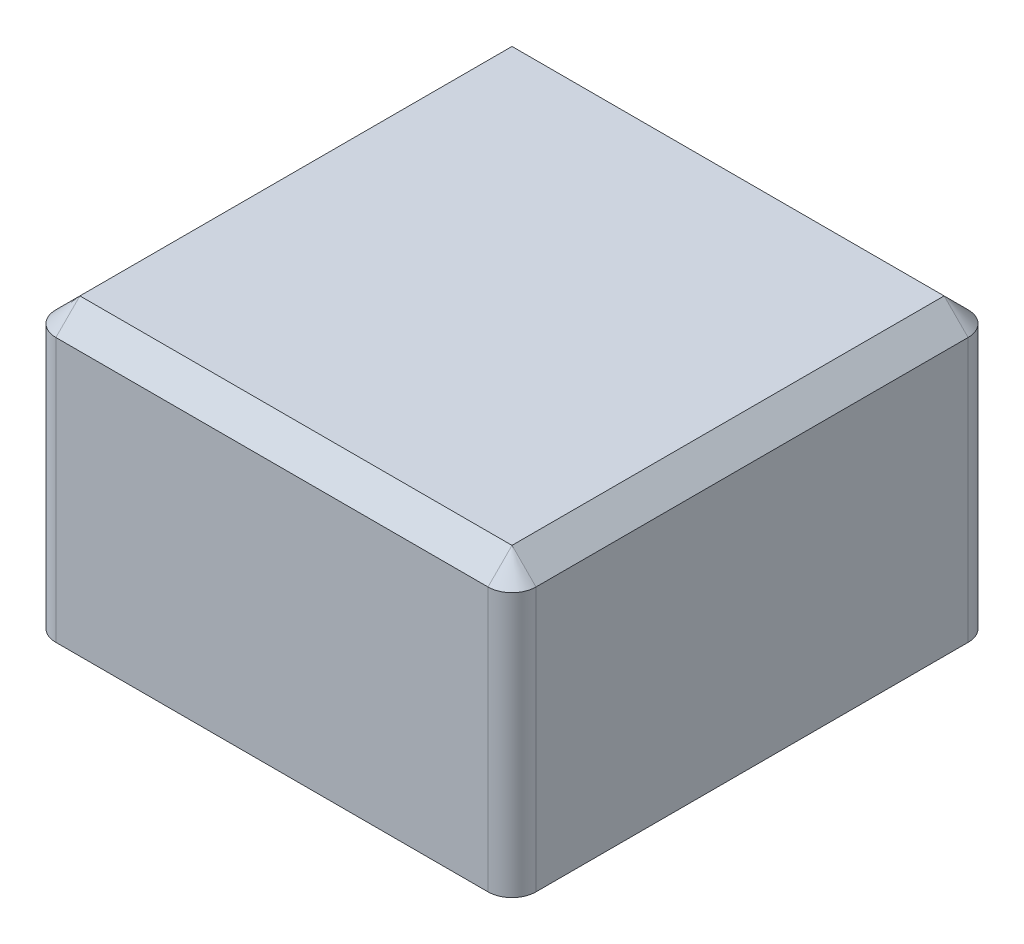
ISO-10303-21;
HEADER;
FILE_DESCRIPTION(('STEP AP214'),'2;1');
FILE_NAME('part.step','',(''),(''),'','','');
FILE_SCHEMA(('AUTOMOTIVE_DESIGN { 1 0 10303 214 1 1 1 1 }'));
ENDSEC;
DATA;
#1=APPLICATION_CONTEXT('core data for automotive mechanical design processes');
#2=APPLICATION_PROTOCOL_DEFINITION('international standard','automotive_design',2000,#1);
#3=PRODUCT_CONTEXT('',#1,'mechanical');
#4=PRODUCT('Part','Part','',(#3));
#5=PRODUCT_RELATED_PRODUCT_CATEGORY('part','',(#4));
#6=PRODUCT_DEFINITION_FORMATION('','',#4);
#7=PRODUCT_DEFINITION_CONTEXT('part definition',#1,'design');
#8=PRODUCT_DEFINITION('design','',#6,#7);
#9=PRODUCT_DEFINITION_SHAPE('','',#8);
#10=(LENGTH_UNIT() NAMED_UNIT(*) SI_UNIT(.MILLI.,.METRE.));
#11=(NAMED_UNIT(*) PLANE_ANGLE_UNIT() SI_UNIT($,.RADIAN.));
#12=(NAMED_UNIT(*) SI_UNIT($,.STERADIAN.) SOLID_ANGLE_UNIT());
#13=UNCERTAINTY_MEASURE_WITH_UNIT(LENGTH_MEASURE(1.E-05),#10,'distance_accuracy_value','');
#14=(GEOMETRIC_REPRESENTATION_CONTEXT(3) GLOBAL_UNCERTAINTY_ASSIGNED_CONTEXT((#13)) GLOBAL_UNIT_ASSIGNED_CONTEXT((#10,
#11,#12)) REPRESENTATION_CONTEXT('',''));
#15=CARTESIAN_POINT('',(0.,0.,0.));
#16=DIRECTION('',(0.,0.,1.));
#17=DIRECTION('',(1.,0.,0.));
#18=AXIS2_PLACEMENT_3D('',#15,#16,#17);
#19=CARTESIAN_POINT('',(0.,0.,100.));
#20=DIRECTION('',(0.,0.,1.));
#21=DIRECTION('',(1.,0.,0.));
#22=AXIS2_PLACEMENT_3D('',#19,#20,#21);
#23=PLANE('',#22);
#24=DIRECTION('',(0.,1.,0.));
#25=VECTOR('',#24,1.);
#26=CARTESIAN_POINT('',(95.,0.,100.));
#27=LINE('',#26,#25);
#28=CARTESIAN_POINT('',(95.,0.,100.));
#29=VERTEX_POINT('',#28);
#30=CARTESIAN_POINT('',(95.,55.,100.));
#31=VERTEX_POINT('',#30);
#32=EDGE_CURVE('E173',#29,#31,#27,.T.);
#33=ORIENTED_EDGE('',*,*,#32,.T.);
#34=DIRECTION('',(-1.,0.,0.));
#35=VECTOR('',#34,1.);
#36=CARTESIAN_POINT('',(0.,55.,100.));
#37=LINE('',#36,#35);
#38=CARTESIAN_POINT('',(5.,55.,100.));
#39=VERTEX_POINT('',#38);
#40=EDGE_CURVE('E168',#31,#39,#37,.T.);
#41=ORIENTED_EDGE('',*,*,#40,.T.);
#42=DIRECTION('',(0.,-1.,0.));
#43=VECTOR('',#42,1.);
#44=CARTESIAN_POINT('',(5.,0.,100.));
#45=LINE('',#44,#43);
#46=CARTESIAN_POINT('',(5.,0.,100.));
#47=VERTEX_POINT('',#46);
#48=EDGE_CURVE('E161',#39,#47,#45,.T.);
#49=ORIENTED_EDGE('',*,*,#48,.T.);
#50=DIRECTION('',(1.,0.,0.));
#51=VECTOR('',#50,1.);
#52=CARTESIAN_POINT('',(0.,0.,100.));
#53=LINE('',#52,#51);
#54=EDGE_CURVE('E165',#47,#29,#53,.T.);
#55=ORIENTED_EDGE('',*,*,#54,.T.);
#56=EDGE_LOOP('',(#33,#41,#49,#55));
#57=FACE_BOUND('',#56,.T.);
#58=ADVANCED_FACE('F80',(#57),#23,.T.);
#59=CARTESIAN_POINT('',(0.,0.,0.));
#60=DIRECTION('',(0.,0.,1.));
#61=DIRECTION('',(1.,0.,0.));
#62=AXIS2_PLACEMENT_3D('',#59,#60,#61);
#63=PLANE('',#62);
#64=DIRECTION('',(0.,-1.,0.));
#65=VECTOR('',#64,1.);
#66=CARTESIAN_POINT('',(5.,60.,0.));
#67=LINE('',#66,#65);
#68=CARTESIAN_POINT('',(5.,0.,0.));
#69=VERTEX_POINT('',#68);
#70=CARTESIAN_POINT('',(5.,55.,0.));
#71=VERTEX_POINT('',#70);
#72=EDGE_CURVE('E226',#69,#71,#67,.F.);
#73=ORIENTED_EDGE('',*,*,#72,.T.);
#74=DIRECTION('',(1.,0.,0.));
#75=VECTOR('',#74,1.);
#76=CARTESIAN_POINT('',(95.,55.,0.));
#77=LINE('',#76,#75);
#78=CARTESIAN_POINT('',(95.,55.,0.));
#79=VERTEX_POINT('',#78);
#80=EDGE_CURVE('E106',#71,#79,#77,.T.);
#81=ORIENTED_EDGE('',*,*,#80,.T.);
#82=DIRECTION('',(0.,1.,0.));
#83=VECTOR('',#82,1.);
#84=CARTESIAN_POINT('',(95.,0.,0.));
#85=LINE('',#84,#83);
#86=CARTESIAN_POINT('',(95.,0.,0.));
#87=VERTEX_POINT('',#86);
#88=EDGE_CURVE('E223',#79,#87,#85,.F.);
#89=ORIENTED_EDGE('',*,*,#88,.T.);
#90=DIRECTION('',(1.,0.,0.));
#91=VECTOR('',#90,1.);
#92=CARTESIAN_POINT('',(0.,0.,0.));
#93=LINE('',#92,#91);
#94=EDGE_CURVE('E196',#69,#87,#93,.T.);
#95=ORIENTED_EDGE('',*,*,#94,.F.);
#96=EDGE_LOOP('',(#73,#81,#89,#95));
#97=FACE_BOUND('',#96,.T.);
#98=ADVANCED_FACE('F310',(#97),#63,.F.);
#99=CARTESIAN_POINT('',(100.,60.,0.));
#100=DIRECTION('',(0.,1.,0.));
#101=DIRECTION('',(0.,0.,1.));
#102=AXIS2_PLACEMENT_3D('',#99,#100,#101);
#103=PLANE('',#102);
#104=DIRECTION('',(0.,0.,1.));
#105=VECTOR('',#104,1.);
#106=CARTESIAN_POINT('',(5.00000000000002,60.,0.));
#107=LINE('',#106,#105);
#108=CARTESIAN_POINT('',(5.,60.,5.00000000000002));
#109=VERTEX_POINT('',#108);
#110=CARTESIAN_POINT('',(5.00000000000002,60.,95.));
#111=VERTEX_POINT('',#110);
#112=EDGE_CURVE('E247',#109,#111,#107,.T.);
#113=ORIENTED_EDGE('',*,*,#112,.T.);
#114=DIRECTION('',(1.,0.,0.));
#115=VECTOR('',#114,1.);
#116=CARTESIAN_POINT('',(100.,60.,95.));
#117=LINE('',#116,#115);
#118=CARTESIAN_POINT('',(95.,60.,95.));
#119=VERTEX_POINT('',#118);
#120=EDGE_CURVE('E250',#111,#119,#117,.T.);
#121=ORIENTED_EDGE('',*,*,#120,.T.);
#122=DIRECTION('',(0.,0.,-1.));
#123=VECTOR('',#122,1.);
#124=CARTESIAN_POINT('',(95.,60.,0.));
#125=LINE('',#124,#123);
#126=CARTESIAN_POINT('',(95.,60.,5.));
#127=VERTEX_POINT('',#126);
#128=EDGE_CURVE('E241',#119,#127,#125,.T.);
#129=ORIENTED_EDGE('',*,*,#128,.T.);
#130=DIRECTION('',(-1.,0.,0.));
#131=VECTOR('',#130,1.);
#132=CARTESIAN_POINT('',(5.,60.,5.00000000000002));
#133=LINE('',#132,#131);
#134=EDGE_CURVE('E244',#127,#109,#133,.T.);
#135=ORIENTED_EDGE('',*,*,#134,.T.);
#136=EDGE_LOOP('',(#113,#121,#129,#135));
#137=FACE_BOUND('',#136,.T.);
#138=ADVANCED_FACE('F359',(#137),#103,.T.);
#139=CARTESIAN_POINT('',(100.,0.,0.));
#140=DIRECTION('',(1.,0.,0.));
#141=DIRECTION('',(0.,0.,-1.));
#142=AXIS2_PLACEMENT_3D('',#139,#140,#141);
#143=PLANE('',#142);
#144=DIRECTION('',(0.,1.,0.));
#145=VECTOR('',#144,1.);
#146=CARTESIAN_POINT('',(100.,60.,5.));
#147=LINE('',#146,#145);
#148=CARTESIAN_POINT('',(100.,0.,5.));
#149=VERTEX_POINT('',#148);
#150=CARTESIAN_POINT('',(100.,55.,5.));
#151=VERTEX_POINT('',#150);
#152=EDGE_CURVE('E232',#149,#151,#147,.T.);
#153=ORIENTED_EDGE('',*,*,#152,.T.);
#154=DIRECTION('',(0.,0.,1.));
#155=VECTOR('',#154,1.);
#156=CARTESIAN_POINT('',(100.,55.,0.));
#157=LINE('',#156,#155);
#158=CARTESIAN_POINT('',(100.,55.,95.));
#159=VERTEX_POINT('',#158);
#160=EDGE_CURVE('E12',#151,#159,#157,.T.);
#161=ORIENTED_EDGE('',*,*,#160,.T.);
#162=DIRECTION('',(0.,1.,0.));
#163=VECTOR('',#162,1.);
#164=CARTESIAN_POINT('',(100.,0.,95.));
#165=LINE('',#164,#163);
#166=CARTESIAN_POINT('',(100.,0.,95.));
#167=VERTEX_POINT('',#166);
#168=EDGE_CURVE('E229',#159,#167,#165,.F.);
#169=ORIENTED_EDGE('',*,*,#168,.T.);
#170=DIRECTION('',(0.,0.,1.));
#171=VECTOR('',#170,1.);
#172=CARTESIAN_POINT('',(100.,0.,0.));
#173=LINE('',#172,#171);
#174=EDGE_CURVE('E192',#149,#167,#173,.T.);
#175=ORIENTED_EDGE('',*,*,#174,.F.);
#176=EDGE_LOOP('',(#153,#161,#169,#175));
#177=FACE_BOUND('',#176,.T.);
#178=ADVANCED_FACE('F317',(#177),#143,.T.);
#179=CARTESIAN_POINT('',(0.,0.,0.));
#180=DIRECTION('',(0.,-1.,0.));
#181=DIRECTION('',(0.,0.,-1.));
#182=AXIS2_PLACEMENT_3D('',#179,#180,#181);
#183=PLANE('',#182);
#184=ORIENTED_EDGE('',*,*,#54,.F.);
#185=CARTESIAN_POINT('',(5.,0.,95.));
#186=DIRECTION('',(0.,-1.,0.));
#187=DIRECTION('',(0.,0.,-1.));
#188=AXIS2_PLACEMENT_3D('',#185,#186,#187);
#189=CIRCLE('',#188,5.);
#190=CARTESIAN_POINT('',(0.,0.,95.));
#191=VERTEX_POINT('',#190);
#192=EDGE_CURVE('E176',#47,#191,#189,.T.);
#193=ORIENTED_EDGE('',*,*,#192,.T.);
#194=DIRECTION('',(0.,0.,1.));
#195=VECTOR('',#194,1.);
#196=CARTESIAN_POINT('',(0.,0.,0.));
#197=LINE('',#196,#195);
#198=CARTESIAN_POINT('',(0.,0.,5.));
#199=VERTEX_POINT('',#198);
#200=EDGE_CURVE('E191',#199,#191,#197,.T.);
#201=ORIENTED_EDGE('',*,*,#200,.F.);
#202=CARTESIAN_POINT('',(5.,0.,5.));
#203=DIRECTION('',(0.,-1.,0.));
#204=DIRECTION('',(0.,0.,-1.));
#205=AXIS2_PLACEMENT_3D('',#202,#203,#204);
#206=CIRCLE('',#205,5.);
#207=EDGE_CURVE('E185',#199,#69,#206,.T.);
#208=ORIENTED_EDGE('',*,*,#207,.T.);
#209=ORIENTED_EDGE('',*,*,#94,.T.);
#210=CARTESIAN_POINT('',(95.,0.,5.));
#211=DIRECTION('',(0.,-1.,0.));
#212=DIRECTION('',(0.,0.,-1.));
#213=AXIS2_PLACEMENT_3D('',#210,#211,#212);
#214=CIRCLE('',#213,5.);
#215=EDGE_CURVE('E214',#87,#149,#214,.T.);
#216=ORIENTED_EDGE('',*,*,#215,.T.);
#217=ORIENTED_EDGE('',*,*,#174,.T.);
#218=CARTESIAN_POINT('',(95.,0.,95.));
#219=DIRECTION('',(0.,-1.,0.));
#220=DIRECTION('',(0.,0.,-1.));
#221=AXIS2_PLACEMENT_3D('',#218,#219,#220);
#222=CIRCLE('',#221,5.);
#223=EDGE_CURVE('E172',#167,#29,#222,.T.);
#224=ORIENTED_EDGE('',*,*,#223,.T.);
#225=EDGE_LOOP('',(#184,#193,#201,#208,#209,#216,#217,#224));
#226=FACE_BOUND('',#225,.T.);
#227=ADVANCED_FACE('F187',(#226),#183,.T.);
#228=CARTESIAN_POINT('',(0.,60.,0.));
#229=DIRECTION('',(-1.,0.,0.));
#230=DIRECTION('',(0.,0.,1.));
#231=AXIS2_PLACEMENT_3D('',#228,#229,#230);
#232=PLANE('',#231);
#233=DIRECTION('',(0.,-1.,0.));
#234=VECTOR('',#233,1.);
#235=CARTESIAN_POINT('',(0.,60.,95.));
#236=LINE('',#235,#234);
#237=CARTESIAN_POINT('',(0.,55.,95.));
#238=VERTEX_POINT('',#237);
#239=EDGE_CURVE('E179',#191,#238,#236,.F.);
#240=ORIENTED_EDGE('',*,*,#239,.T.);
#241=DIRECTION('',(0.,0.,-1.));
#242=VECTOR('',#241,1.);
#243=CARTESIAN_POINT('',(0.,55.,0.));
#244=LINE('',#243,#242);
#245=CARTESIAN_POINT('',(0.,55.,5.));
#246=VERTEX_POINT('',#245);
#247=EDGE_CURVE('E257',#238,#246,#244,.T.);
#248=ORIENTED_EDGE('',*,*,#247,.T.);
#249=DIRECTION('',(0.,-1.,0.));
#250=VECTOR('',#249,1.);
#251=CARTESIAN_POINT('',(0.,0.,5.));
#252=LINE('',#251,#250);
#253=EDGE_CURVE('E184',#246,#199,#252,.T.);
#254=ORIENTED_EDGE('',*,*,#253,.T.);
#255=ORIENTED_EDGE('',*,*,#200,.T.);
#256=EDGE_LOOP('',(#240,#248,#254,#255));
#257=FACE_BOUND('',#256,.T.);
#258=ADVANCED_FACE('F345',(#257),#232,.T.);
#259=CARTESIAN_POINT('',(5.,0.,95.));
#260=DIRECTION('',(0.,-1.,0.));
#261=DIRECTION('',(0.,0.,-1.));
#262=AXIS2_PLACEMENT_3D('',#259,#260,#261);
#263=CYLINDRICAL_SURFACE('',#262,5.);
#264=ORIENTED_EDGE('',*,*,#48,.F.);
#265=CARTESIAN_POINT('',(5.,55.,95.));
#266=DIRECTION('',(0.,1.,0.));
#267=DIRECTION('',(0.,0.,1.));
#268=AXIS2_PLACEMENT_3D('',#265,#266,#267);
#269=CIRCLE('',#268,5.);
#270=EDGE_CURVE('E254',#39,#238,#269,.F.);
#271=ORIENTED_EDGE('',*,*,#270,.T.);
#272=ORIENTED_EDGE('',*,*,#239,.F.);
#273=ORIENTED_EDGE('',*,*,#192,.F.);
#274=EDGE_LOOP('',(#264,#271,#272,#273));
#275=FACE_BOUND('',#274,.T.);
#276=ADVANCED_FACE('F177',(#275),#263,.T.);
#277=CARTESIAN_POINT('',(5.,60.,5.));
#278=DIRECTION('',(0.,1.,0.));
#279=DIRECTION('',(0.,0.,1.));
#280=AXIS2_PLACEMENT_3D('',#277,#278,#279);
#281=CYLINDRICAL_SURFACE('',#280,5.);
#282=ORIENTED_EDGE('',*,*,#253,.F.);
#283=CARTESIAN_POINT('',(5.,55.,5.));
#284=DIRECTION('',(0.,1.,0.));
#285=DIRECTION('',(0.,0.,1.));
#286=AXIS2_PLACEMENT_3D('',#283,#284,#285);
#287=CIRCLE('',#286,5.);
#288=EDGE_CURVE('E260',#246,#71,#287,.F.);
#289=ORIENTED_EDGE('',*,*,#288,.T.);
#290=ORIENTED_EDGE('',*,*,#72,.F.);
#291=ORIENTED_EDGE('',*,*,#207,.F.);
#292=EDGE_LOOP('',(#282,#289,#290,#291));
#293=FACE_BOUND('',#292,.T.);
#294=ADVANCED_FACE('F307',(#293),#281,.T.);
#295=CARTESIAN_POINT('',(95.,0.,5.));
#296=DIRECTION('',(0.,-1.,0.));
#297=DIRECTION('',(0.,0.,-1.));
#298=AXIS2_PLACEMENT_3D('',#295,#296,#297);
#299=CYLINDRICAL_SURFACE('',#298,5.);
#300=ORIENTED_EDGE('',*,*,#88,.F.);
#301=CARTESIAN_POINT('',(95.,55.,5.));
#302=DIRECTION('',(0.,1.,0.));
#303=DIRECTION('',(0.,0.,1.));
#304=AXIS2_PLACEMENT_3D('',#301,#302,#303);
#305=CIRCLE('',#304,5.);
#306=EDGE_CURVE('E91',#79,#151,#305,.F.);
#307=ORIENTED_EDGE('',*,*,#306,.T.);
#308=ORIENTED_EDGE('',*,*,#152,.F.);
#309=ORIENTED_EDGE('',*,*,#215,.F.);
#310=EDGE_LOOP('',(#300,#307,#308,#309));
#311=FACE_BOUND('',#310,.T.);
#312=ADVANCED_FACE('F313',(#311),#299,.T.);
#313=CARTESIAN_POINT('',(95.,0.,95.));
#314=DIRECTION('',(0.,1.,0.));
#315=DIRECTION('',(0.,0.,1.));
#316=AXIS2_PLACEMENT_3D('',#313,#314,#315);
#317=CYLINDRICAL_SURFACE('',#316,5.);
#318=ORIENTED_EDGE('',*,*,#168,.F.);
#319=CARTESIAN_POINT('',(95.,55.,95.));
#320=DIRECTION('',(0.,1.,0.));
#321=DIRECTION('',(0.,0.,1.));
#322=AXIS2_PLACEMENT_3D('',#319,#320,#321);
#323=CIRCLE('',#322,5.);
#324=EDGE_CURVE('E235',#159,#31,#323,.F.);
#325=ORIENTED_EDGE('',*,*,#324,.T.);
#326=ORIENTED_EDGE('',*,*,#32,.F.);
#327=ORIENTED_EDGE('',*,*,#223,.F.);
#328=EDGE_LOOP('',(#318,#325,#326,#327));
#329=FACE_BOUND('',#328,.T.);
#330=ADVANCED_FACE('F335',(#329),#317,.T.);
#331=CARTESIAN_POINT('',(5.,55.,5.));
#332=DIRECTION('',(0.,-1.,0.));
#333=DIRECTION('',(0.,0.,-1.));
#334=AXIS2_PLACEMENT_3D('',#331,#332,#333);
#335=CONICAL_SURFACE('',#334,5.00000000000002,0.785398163397452);
#336=DIRECTION('',(0.,0.707106781186545,0.70710678118655));
#337=VECTOR('',#336,1.);
#338=CARTESIAN_POINT('',(5.,55.,0.));
#339=LINE('',#338,#337);
#340=EDGE_CURVE('E288',#71,#109,#339,.T.);
#341=ORIENTED_EDGE('',*,*,#340,.F.);
#342=ORIENTED_EDGE('',*,*,#288,.F.);
#343=DIRECTION('',(-0.707106781186551,-0.707106781186545,0.));
#344=VECTOR('',#343,1.);
#345=CARTESIAN_POINT('',(5.00000000000002,60.,5.));
#346=LINE('',#345,#344);
#347=EDGE_CURVE('E85',#109,#246,#346,.T.);
#348=ORIENTED_EDGE('',*,*,#347,.F.);
#349=EDGE_LOOP('',(#341,#342,#348));
#350=FACE_BOUND('',#349,.T.);
#351=ADVANCED_FACE('F83',(#350),#335,.T.);
#352=CARTESIAN_POINT('',(5.00000000000002,60.,0.));
#353=DIRECTION('',(0.707106781186545,-0.70710678118655,0.));
#354=DIRECTION('',(0.,0.,1.));
#355=AXIS2_PLACEMENT_3D('',#352,#353,#354);
#356=PLANE('',#355);
#357=ORIENTED_EDGE('',*,*,#347,.T.);
#358=ORIENTED_EDGE('',*,*,#247,.F.);
#359=DIRECTION('',(-0.70710678118655,-0.707106781186545,0.));
#360=VECTOR('',#359,1.);
#361=CARTESIAN_POINT('',(5.00000000000002,60.,95.));
#362=LINE('',#361,#360);
#363=EDGE_CURVE('E285',#111,#238,#362,.T.);
#364=ORIENTED_EDGE('',*,*,#363,.F.);
#365=ORIENTED_EDGE('',*,*,#112,.F.);
#366=EDGE_LOOP('',(#357,#358,#364,#365));
#367=FACE_BOUND('',#366,.T.);
#368=ADVANCED_FACE('F300',(#367),#356,.F.);
#369=CARTESIAN_POINT('',(100.,60.,5.00000000000002));
#370=DIRECTION('',(0.,0.70710678118655,-0.707106781186545));
#371=DIRECTION('',(1.,0.,0.));
#372=AXIS2_PLACEMENT_3D('',#369,#370,#371);
#373=PLANE('',#372);
#374=ORIENTED_EDGE('',*,*,#340,.T.);
#375=ORIENTED_EDGE('',*,*,#134,.F.);
#376=DIRECTION('',(0.,0.707106781186545,0.70710678118655));
#377=VECTOR('',#376,1.);
#378=CARTESIAN_POINT('',(95.,55.,0.));
#379=LINE('',#378,#377);
#380=EDGE_CURVE('E281',#79,#127,#379,.T.);
#381=ORIENTED_EDGE('',*,*,#380,.F.);
#382=ORIENTED_EDGE('',*,*,#80,.F.);
#383=EDGE_LOOP('',(#374,#375,#381,#382));
#384=FACE_BOUND('',#383,.T.);
#385=ADVANCED_FACE('F393',(#384),#373,.T.);
#386=CARTESIAN_POINT('',(5.,55.,95.));
#387=DIRECTION('',(0.,-1.,0.));
#388=DIRECTION('',(0.,0.,-1.));
#389=AXIS2_PLACEMENT_3D('',#386,#387,#388);
#390=CONICAL_SURFACE('',#389,5.00000000000002,0.785398163397452);
#391=ORIENTED_EDGE('',*,*,#363,.T.);
#392=ORIENTED_EDGE('',*,*,#270,.F.);
#393=DIRECTION('',(0.,-0.707106781186545,0.70710678118655));
#394=VECTOR('',#393,1.);
#395=CARTESIAN_POINT('',(5.,60.,95.));
#396=LINE('',#395,#394);
#397=EDGE_CURVE('E277',#111,#39,#396,.T.);
#398=ORIENTED_EDGE('',*,*,#397,.F.);
#399=EDGE_LOOP('',(#391,#392,#398));
#400=FACE_BOUND('',#399,.T.);
#401=ADVANCED_FACE('F402',(#400),#390,.T.);
#402=CARTESIAN_POINT('',(95.,55.,5.));
#403=DIRECTION('',(0.,-1.,0.));
#404=DIRECTION('',(0.,0.,-1.));
#405=AXIS2_PLACEMENT_3D('',#402,#403,#404);
#406=CONICAL_SURFACE('',#405,5.00000000000002,0.785398163397452);
#407=ORIENTED_EDGE('',*,*,#306,.F.);
#408=ORIENTED_EDGE('',*,*,#380,.T.);
#409=DIRECTION('',(-0.70710678118655,0.707106781186545,0.));
#410=VECTOR('',#409,1.);
#411=CARTESIAN_POINT('',(100.,55.,5.));
#412=LINE('',#411,#410);
#413=EDGE_CURVE('E273',#151,#127,#412,.T.);
#414=ORIENTED_EDGE('',*,*,#413,.F.);
#415=EDGE_LOOP('',(#407,#408,#414));
#416=FACE_BOUND('',#415,.T.);
#417=ADVANCED_FACE('F321',(#416),#406,.T.);
#418=CARTESIAN_POINT('',(0.,55.,100.));
#419=DIRECTION('',(0.,-0.70710678118655,-0.707106781186545));
#420=DIRECTION('',(-1.,0.,0.));
#421=AXIS2_PLACEMENT_3D('',#418,#419,#420);
#422=PLANE('',#421);
#423=ORIENTED_EDGE('',*,*,#397,.T.);
#424=ORIENTED_EDGE('',*,*,#40,.F.);
#425=DIRECTION('',(0.,-0.707106781186545,0.70710678118655));
#426=VECTOR('',#425,1.);
#427=CARTESIAN_POINT('',(95.,60.,95.));
#428=LINE('',#427,#426);
#429=EDGE_CURVE('E270',#119,#31,#428,.T.);
#430=ORIENTED_EDGE('',*,*,#429,.F.);
#431=ORIENTED_EDGE('',*,*,#120,.F.);
#432=EDGE_LOOP('',(#423,#424,#430,#431));
#433=FACE_BOUND('',#432,.T.);
#434=ADVANCED_FACE('F332',(#433),#422,.F.);
#435=CARTESIAN_POINT('',(100.,55.,0.));
#436=DIRECTION('',(-0.707106781186545,-0.70710678118655,0.));
#437=DIRECTION('',(0.,0.,1.));
#438=AXIS2_PLACEMENT_3D('',#435,#436,#437);
#439=PLANE('',#438);
#440=ORIENTED_EDGE('',*,*,#413,.T.);
#441=ORIENTED_EDGE('',*,*,#128,.F.);
#442=DIRECTION('',(-0.70710678118655,0.707106781186545,0.));
#443=VECTOR('',#442,1.);
#444=CARTESIAN_POINT('',(100.,55.,95.));
#445=LINE('',#444,#443);
#446=EDGE_CURVE('E267',#159,#119,#445,.T.);
#447=ORIENTED_EDGE('',*,*,#446,.F.);
#448=ORIENTED_EDGE('',*,*,#160,.F.);
#449=EDGE_LOOP('',(#440,#441,#447,#448));
#450=FACE_BOUND('',#449,.T.);
#451=ADVANCED_FACE('F325',(#450),#439,.F.);
#452=CARTESIAN_POINT('',(95.,55.,95.));
#453=DIRECTION('',(0.,-1.,0.));
#454=DIRECTION('',(0.,0.,-1.));
#455=AXIS2_PLACEMENT_3D('',#452,#453,#454);
#456=CONICAL_SURFACE('',#455,5.00000000000002,0.785398163397452);
#457=ORIENTED_EDGE('',*,*,#429,.T.);
#458=ORIENTED_EDGE('',*,*,#324,.F.);
#459=ORIENTED_EDGE('',*,*,#446,.T.);
#460=EDGE_LOOP('',(#457,#458,#459));
#461=FACE_BOUND('',#460,.T.);
#462=ADVANCED_FACE('F329',(#461),#456,.T.);
#463=CLOSED_SHELL('',(#58,#98,#138,#178,#227,#258,#276,#294,#312,#330,#351,#368,#385,#401,#417,
#434,#451,#462));
#464=MANIFOLD_SOLID_BREP('B2',#463);
#465=ADVANCED_BREP_SHAPE_REPRESENTATION('',(#18,#464),#14);
#466=SHAPE_DEFINITION_REPRESENTATION(#9,#465);
ENDSEC;
END-ISO-10303-21;
